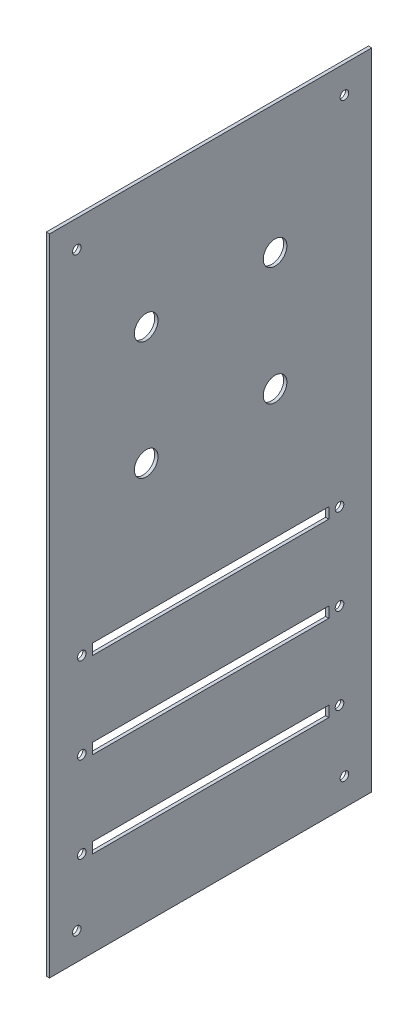
ISO-10303-21;
HEADER;
FILE_DESCRIPTION(('STEP AP214'),'2;1');
FILE_NAME('part.step','',(''),(''),'','','');
FILE_SCHEMA(('AUTOMOTIVE_DESIGN { 1 0 10303 214 1 1 1 1 }'));
ENDSEC;
DATA;
#1=APPLICATION_CONTEXT('core data for automotive mechanical design processes');
#2=APPLICATION_PROTOCOL_DEFINITION('international standard','automotive_design',2000,#1);
#3=PRODUCT_CONTEXT('',#1,'mechanical');
#4=PRODUCT('Part','Part','',(#3));
#5=PRODUCT_RELATED_PRODUCT_CATEGORY('part','',(#4));
#6=PRODUCT_DEFINITION_FORMATION('','',#4);
#7=PRODUCT_DEFINITION_CONTEXT('part definition',#1,'design');
#8=PRODUCT_DEFINITION('design','',#6,#7);
#9=PRODUCT_DEFINITION_SHAPE('','',#8);
#10=(LENGTH_UNIT() NAMED_UNIT(*) SI_UNIT(.MILLI.,.METRE.));
#11=(NAMED_UNIT(*) PLANE_ANGLE_UNIT() SI_UNIT($,.RADIAN.));
#12=(NAMED_UNIT(*) SI_UNIT($,.STERADIAN.) SOLID_ANGLE_UNIT());
#13=UNCERTAINTY_MEASURE_WITH_UNIT(LENGTH_MEASURE(1.E-05),#10,'distance_accuracy_value','');
#14=(GEOMETRIC_REPRESENTATION_CONTEXT(3) GLOBAL_UNCERTAINTY_ASSIGNED_CONTEXT((#13)) GLOBAL_UNIT_ASSIGNED_CONTEXT((#10,
#11,#12)) REPRESENTATION_CONTEXT('',''));
#15=CARTESIAN_POINT('',(0.,0.,0.));
#16=DIRECTION('',(0.,0.,1.));
#17=DIRECTION('',(1.,0.,0.));
#18=AXIS2_PLACEMENT_3D('',#15,#16,#17);
#19=CARTESIAN_POINT('',(1.52,150.,75.));
#20=DIRECTION('',(0.,-1.,0.));
#21=DIRECTION('',(0.,0.,-1.));
#22=AXIS2_PLACEMENT_3D('',#19,#20,#21);
#23=PLANE('',#22);
#24=DIRECTION('',(0.,0.,1.));
#25=VECTOR('',#24,1.);
#26=CARTESIAN_POINT('',(0.,150.,75.));
#27=LINE('',#26,#25);
#28=CARTESIAN_POINT('',(0.,150.,-75.));
#29=VERTEX_POINT('',#28);
#30=CARTESIAN_POINT('',(0.,150.,75.));
#31=VERTEX_POINT('',#30);
#32=EDGE_CURVE('E3880',#29,#31,#27,.T.);
#33=ORIENTED_EDGE('',*,*,#32,.T.);
#34=DIRECTION('',(-1.,0.,0.));
#35=VECTOR('',#34,1.);
#36=CARTESIAN_POINT('',(1.52,150.,75.));
#37=LINE('',#36,#35);
#38=CARTESIAN_POINT('',(1.52,150.,75.));
#39=VERTEX_POINT('',#38);
#40=EDGE_CURVE('E12',#39,#31,#37,.T.);
#41=ORIENTED_EDGE('',*,*,#40,.F.);
#42=DIRECTION('',(0.,0.,1.));
#43=VECTOR('',#42,1.);
#44=CARTESIAN_POINT('',(1.52,150.,75.));
#45=LINE('',#44,#43);
#46=CARTESIAN_POINT('',(1.52,150.,-75.));
#47=VERTEX_POINT('',#46);
#48=EDGE_CURVE('E3878',#47,#39,#45,.T.);
#49=ORIENTED_EDGE('',*,*,#48,.F.);
#50=DIRECTION('',(-1.,0.,0.));
#51=VECTOR('',#50,1.);
#52=CARTESIAN_POINT('',(1.52,150.,-75.));
#53=LINE('',#52,#51);
#54=EDGE_CURVE('E3895',#47,#29,#53,.T.);
#55=ORIENTED_EDGE('',*,*,#54,.T.);
#56=EDGE_LOOP('',(#33,#41,#49,#55));
#57=FACE_BOUND('',#56,.T.);
#58=ADVANCED_FACE('F3572',(#57),#23,.F.);
#59=CARTESIAN_POINT('',(1.52,-150.,75.));
#60=DIRECTION('',(0.,0.,-1.));
#61=DIRECTION('',(0.,1.,0.));
#62=AXIS2_PLACEMENT_3D('',#59,#60,#61);
#63=PLANE('',#62);
#64=DIRECTION('',(0.,-1.,0.));
#65=VECTOR('',#64,1.);
#66=CARTESIAN_POINT('',(0.,-150.,75.));
#67=LINE('',#66,#65);
#68=CARTESIAN_POINT('',(0.,-150.,75.));
#69=VERTEX_POINT('',#68);
#70=EDGE_CURVE('E3899',#31,#69,#67,.T.);
#71=ORIENTED_EDGE('',*,*,#70,.T.);
#72=DIRECTION('',(-1.,0.,0.));
#73=VECTOR('',#72,1.);
#74=CARTESIAN_POINT('',(1.52,-150.,75.));
#75=LINE('',#74,#73);
#76=CARTESIAN_POINT('',(1.52,-150.,75.));
#77=VERTEX_POINT('',#76);
#78=EDGE_CURVE('E3585',#77,#69,#75,.T.);
#79=ORIENTED_EDGE('',*,*,#78,.F.);
#80=DIRECTION('',(0.,-1.,0.));
#81=VECTOR('',#80,1.);
#82=CARTESIAN_POINT('',(1.52,-150.,75.));
#83=LINE('',#82,#81);
#84=EDGE_CURVE('E3885',#39,#77,#83,.T.);
#85=ORIENTED_EDGE('',*,*,#84,.F.);
#86=ORIENTED_EDGE('',*,*,#40,.T.);
#87=EDGE_LOOP('',(#71,#79,#85,#86));
#88=FACE_BOUND('',#87,.T.);
#89=ADVANCED_FACE('F3931',(#88),#63,.F.);
#90=CARTESIAN_POINT('',(1.52,-150.,75.));
#91=DIRECTION('',(0.,1.,0.));
#92=DIRECTION('',(0.,0.,1.));
#93=AXIS2_PLACEMENT_3D('',#90,#91,#92);
#94=PLANE('',#93);
#95=DIRECTION('',(0.,0.,-1.));
#96=VECTOR('',#95,1.);
#97=CARTESIAN_POINT('',(0.,-150.,75.));
#98=LINE('',#97,#96);
#99=CARTESIAN_POINT('',(0.,-150.,-75.));
#100=VERTEX_POINT('',#99);
#101=EDGE_CURVE('E3898',#69,#100,#98,.T.);
#102=ORIENTED_EDGE('',*,*,#101,.T.);
#103=DIRECTION('',(-1.,0.,0.));
#104=VECTOR('',#103,1.);
#105=CARTESIAN_POINT('',(1.52,-150.,-75.));
#106=LINE('',#105,#104);
#107=CARTESIAN_POINT('',(1.52,-150.,-75.));
#108=VERTEX_POINT('',#107);
#109=EDGE_CURVE('E3906',#108,#100,#106,.T.);
#110=ORIENTED_EDGE('',*,*,#109,.F.);
#111=DIRECTION('',(0.,0.,-1.));
#112=VECTOR('',#111,1.);
#113=CARTESIAN_POINT('',(1.52,-150.,75.));
#114=LINE('',#113,#112);
#115=EDGE_CURVE('E3886',#77,#108,#114,.T.);
#116=ORIENTED_EDGE('',*,*,#115,.F.);
#117=ORIENTED_EDGE('',*,*,#78,.T.);
#118=EDGE_LOOP('',(#102,#110,#116,#117));
#119=FACE_BOUND('',#118,.T.);
#120=ADVANCED_FACE('F3920',(#119),#94,.F.);
#121=CARTESIAN_POINT('',(1.52,-150.,-75.));
#122=DIRECTION('',(0.,0.,1.));
#123=DIRECTION('',(1.,0.,0.));
#124=AXIS2_PLACEMENT_3D('',#121,#122,#123);
#125=PLANE('',#124);
#126=DIRECTION('',(0.,1.,0.));
#127=VECTOR('',#126,1.);
#128=CARTESIAN_POINT('',(0.,-150.,-75.));
#129=LINE('',#128,#127);
#130=EDGE_CURVE('E3883',#100,#29,#129,.T.);
#131=ORIENTED_EDGE('',*,*,#130,.T.);
#132=ORIENTED_EDGE('',*,*,#54,.F.);
#133=DIRECTION('',(0.,1.,0.));
#134=VECTOR('',#133,1.);
#135=CARTESIAN_POINT('',(1.52,-150.,-75.));
#136=LINE('',#135,#134);
#137=EDGE_CURVE('E3888',#108,#47,#136,.T.);
#138=ORIENTED_EDGE('',*,*,#137,.F.);
#139=ORIENTED_EDGE('',*,*,#109,.T.);
#140=EDGE_LOOP('',(#131,#132,#138,#139));
#141=FACE_BOUND('',#140,.T.);
#142=ADVANCED_FACE('F3929',(#141),#125,.F.);
#143=CARTESIAN_POINT('',(1.52,0.,0.));
#144=DIRECTION('',(1.,0.,0.));
#145=DIRECTION('',(0.,0.,-1.));
#146=AXIS2_PLACEMENT_3D('',#143,#144,#145);
#147=PLANE('',#146);
#148=CARTESIAN_POINT('',(1.52,35.,-30.));
#149=DIRECTION('',(1.,0.,0.));
#150=DIRECTION('',(0.,0.,-1.));
#151=AXIS2_PLACEMENT_3D('',#148,#149,#150);
#152=CIRCLE('',#151,5.5);
#153=CARTESIAN_POINT('',(1.52,35.,-35.5));
#154=VERTEX_POINT('',#153);
#155=EDGE_CURVE('E4053',#154,#154,#152,.T.);
#156=ORIENTED_EDGE('',*,*,#155,.F.);
#157=EDGE_LOOP('',(#156));
#158=FACE_BOUND('',#157,.T.);
#159=CARTESIAN_POINT('',(1.52,90.,-30.));
#160=DIRECTION('',(1.,0.,0.));
#161=DIRECTION('',(0.,0.,-1.));
#162=AXIS2_PLACEMENT_3D('',#159,#160,#161);
#163=CIRCLE('',#162,5.50000000000001);
#164=CARTESIAN_POINT('',(1.52,90.,-35.5));
#165=VERTEX_POINT('',#164);
#166=EDGE_CURVE('E4063',#165,#165,#163,.T.);
#167=ORIENTED_EDGE('',*,*,#166,.F.);
#168=EDGE_LOOP('',(#167));
#169=FACE_BOUND('',#168,.T.);
#170=CARTESIAN_POINT('',(1.52,35.,30.));
#171=DIRECTION('',(1.,0.,0.));
#172=DIRECTION('',(0.,0.,-1.));
#173=AXIS2_PLACEMENT_3D('',#170,#171,#172);
#174=CIRCLE('',#173,5.5);
#175=CARTESIAN_POINT('',(1.52,35.,24.5));
#176=VERTEX_POINT('',#175);
#177=EDGE_CURVE('E4071',#176,#176,#174,.T.);
#178=ORIENTED_EDGE('',*,*,#177,.F.);
#179=EDGE_LOOP('',(#178));
#180=FACE_BOUND('',#179,.T.);
#181=CARTESIAN_POINT('',(1.52,90.,30.));
#182=DIRECTION('',(1.,0.,0.));
#183=DIRECTION('',(0.,0.,-1.));
#184=AXIS2_PLACEMENT_3D('',#181,#182,#183);
#185=CIRCLE('',#184,5.50000000000001);
#186=CARTESIAN_POINT('',(1.52,90.,24.5));
#187=VERTEX_POINT('',#186);
#188=EDGE_CURVE('E4077',#187,#187,#185,.T.);
#189=ORIENTED_EDGE('',*,*,#188,.F.);
#190=EDGE_LOOP('',(#189));
#191=FACE_BOUND('',#190,.T.);
#192=CARTESIAN_POINT('',(1.52,-27.4999999999999,-60.));
#193=DIRECTION('',(1.,0.,0.));
#194=DIRECTION('',(0.,0.,-1.));
#195=AXIS2_PLACEMENT_3D('',#192,#193,#194);
#196=CIRCLE('',#195,1.99999999999999);
#197=CARTESIAN_POINT('',(1.52,-27.4999999999999,-62.));
#198=VERTEX_POINT('',#197);
#199=EDGE_CURVE('E4090',#198,#198,#196,.T.);
#200=ORIENTED_EDGE('',*,*,#199,.F.);
#201=EDGE_LOOP('',(#200));
#202=FACE_BOUND('',#201,.T.);
#203=CARTESIAN_POINT('',(1.52,-27.4999999999999,60.));
#204=DIRECTION('',(1.,0.,0.));
#205=DIRECTION('',(0.,0.,-1.));
#206=AXIS2_PLACEMENT_3D('',#203,#204,#205);
#207=CIRCLE('',#206,1.99999999999999);
#208=CARTESIAN_POINT('',(1.52,-27.4999999999999,58.));
#209=VERTEX_POINT('',#208);
#210=EDGE_CURVE('E4092',#209,#209,#207,.T.);
#211=ORIENTED_EDGE('',*,*,#210,.F.);
#212=EDGE_LOOP('',(#211));
#213=FACE_BOUND('',#212,.T.);
#214=CARTESIAN_POINT('',(1.52,-67.4999999999999,-60.));
#215=DIRECTION('',(1.,0.,0.));
#216=DIRECTION('',(0.,0.,-1.));
#217=AXIS2_PLACEMENT_3D('',#214,#215,#216);
#218=CIRCLE('',#217,2.);
#219=CARTESIAN_POINT('',(1.52,-67.4999999999999,-62.));
#220=VERTEX_POINT('',#219);
#221=EDGE_CURVE('E4105',#220,#220,#218,.T.);
#222=ORIENTED_EDGE('',*,*,#221,.F.);
#223=EDGE_LOOP('',(#222));
#224=FACE_BOUND('',#223,.T.);
#225=CARTESIAN_POINT('',(1.52,-67.4999999999999,60.));
#226=DIRECTION('',(1.,0.,0.));
#227=DIRECTION('',(0.,0.,-1.));
#228=AXIS2_PLACEMENT_3D('',#225,#226,#227);
#229=CIRCLE('',#228,2.);
#230=CARTESIAN_POINT('',(1.52,-67.4999999999999,58.));
#231=VERTEX_POINT('',#230);
#232=EDGE_CURVE('E4108',#231,#231,#229,.T.);
#233=ORIENTED_EDGE('',*,*,#232,.F.);
#234=EDGE_LOOP('',(#233));
#235=FACE_BOUND('',#234,.T.);
#236=DIRECTION('',(0.,0.,1.));
#237=VECTOR('',#236,1.);
#238=CARTESIAN_POINT('',(1.52,-24.9999999999999,-55.0000000000003));
#239=LINE('',#238,#237);
#240=CARTESIAN_POINT('',(1.52,-24.9999999999999,-55.0000000000003));
#241=VERTEX_POINT('',#240);
#242=CARTESIAN_POINT('',(1.52,-24.9999999999999,54.9999999999997));
#243=VERTEX_POINT('',#242);
#244=EDGE_CURVE('E3588',#241,#243,#239,.T.);
#245=ORIENTED_EDGE('',*,*,#244,.F.);
#246=DIRECTION('',(0.,1.,0.));
#247=VECTOR('',#246,1.);
#248=CARTESIAN_POINT('',(1.52,-29.9999999999999,-55.0000000000003));
#249=LINE('',#248,#247);
#250=CARTESIAN_POINT('',(1.52,-29.9999999999999,-55.0000000000003));
#251=VERTEX_POINT('',#250);
#252=EDGE_CURVE('E3706',#251,#241,#249,.T.);
#253=ORIENTED_EDGE('',*,*,#252,.F.);
#254=DIRECTION('',(0.,0.,-1.));
#255=VECTOR('',#254,1.);
#256=CARTESIAN_POINT('',(1.52,-29.9999999999999,-55.0000000000003));
#257=LINE('',#256,#255);
#258=CARTESIAN_POINT('',(1.52,-29.9999999999999,54.9999999999997));
#259=VERTEX_POINT('',#258);
#260=EDGE_CURVE('E3712',#259,#251,#257,.T.);
#261=ORIENTED_EDGE('',*,*,#260,.F.);
#262=DIRECTION('',(0.,-1.,0.));
#263=VECTOR('',#262,1.);
#264=CARTESIAN_POINT('',(1.52,-29.9999999999999,54.9999999999997));
#265=LINE('',#264,#263);
#266=EDGE_CURVE('E3730',#243,#259,#265,.T.);
#267=ORIENTED_EDGE('',*,*,#266,.F.);
#268=EDGE_LOOP('',(#245,#253,#261,#267));
#269=FACE_BOUND('',#268,.T.);
#270=DIRECTION('',(0.,0.,1.));
#271=VECTOR('',#270,1.);
#272=CARTESIAN_POINT('',(1.52,-64.9999999999999,-55.));
#273=LINE('',#272,#271);
#274=CARTESIAN_POINT('',(1.52,-64.9999999999999,-55.));
#275=VERTEX_POINT('',#274);
#276=CARTESIAN_POINT('',(1.52,-64.9999999999999,55.));
#277=VERTEX_POINT('',#276);
#278=EDGE_CURVE('E3738',#275,#277,#273,.T.);
#279=ORIENTED_EDGE('',*,*,#278,.F.);
#280=DIRECTION('',(0.,1.,0.));
#281=VECTOR('',#280,1.);
#282=CARTESIAN_POINT('',(1.52,-69.9999999999999,-55.));
#283=LINE('',#282,#281);
#284=CARTESIAN_POINT('',(1.52,-69.9999999999999,-55.));
#285=VERTEX_POINT('',#284);
#286=EDGE_CURVE('E3750',#285,#275,#283,.T.);
#287=ORIENTED_EDGE('',*,*,#286,.F.);
#288=DIRECTION('',(0.,0.,-1.));
#289=VECTOR('',#288,1.);
#290=CARTESIAN_POINT('',(1.52,-69.9999999999999,-55.));
#291=LINE('',#290,#289);
#292=CARTESIAN_POINT('',(1.52,-69.9999999999999,55.));
#293=VERTEX_POINT('',#292);
#294=EDGE_CURVE('E3769',#293,#285,#291,.T.);
#295=ORIENTED_EDGE('',*,*,#294,.F.);
#296=DIRECTION('',(0.,-1.,0.));
#297=VECTOR('',#296,1.);
#298=CARTESIAN_POINT('',(1.52,-69.9999999999999,55.));
#299=LINE('',#298,#297);
#300=EDGE_CURVE('E3765',#277,#293,#299,.T.);
#301=ORIENTED_EDGE('',*,*,#300,.F.);
#302=EDGE_LOOP('',(#279,#287,#295,#301));
#303=FACE_BOUND('',#302,.T.);
#304=CARTESIAN_POINT('',(1.52,-107.5,-60.));
#305=DIRECTION('',(1.,0.,0.));
#306=DIRECTION('',(0.,0.,-1.));
#307=AXIS2_PLACEMENT_3D('',#304,#305,#306);
#308=CIRCLE('',#307,1.99999999999999);
#309=CARTESIAN_POINT('',(1.52,-107.5,-62.));
#310=VERTEX_POINT('',#309);
#311=EDGE_CURVE('E3779',#310,#310,#308,.T.);
#312=ORIENTED_EDGE('',*,*,#311,.F.);
#313=EDGE_LOOP('',(#312));
#314=FACE_BOUND('',#313,.T.);
#315=CARTESIAN_POINT('',(1.52,-107.5,60.));
#316=DIRECTION('',(1.,0.,0.));
#317=DIRECTION('',(0.,0.,-1.));
#318=AXIS2_PLACEMENT_3D('',#315,#316,#317);
#319=CIRCLE('',#318,1.99999999999999);
#320=CARTESIAN_POINT('',(1.52,-107.5,58.));
#321=VERTEX_POINT('',#320);
#322=EDGE_CURVE('E3794',#321,#321,#319,.T.);
#323=ORIENTED_EDGE('',*,*,#322,.F.);
#324=EDGE_LOOP('',(#323));
#325=FACE_BOUND('',#324,.T.);
#326=DIRECTION('',(0.,0.,1.));
#327=VECTOR('',#326,1.);
#328=CARTESIAN_POINT('',(1.52,-105.,-55.));
#329=LINE('',#328,#327);
#330=CARTESIAN_POINT('',(1.52,-105.,-55.));
#331=VERTEX_POINT('',#330);
#332=CARTESIAN_POINT('',(1.52,-105.,55.));
#333=VERTEX_POINT('',#332);
#334=EDGE_CURVE('E3803',#331,#333,#329,.T.);
#335=ORIENTED_EDGE('',*,*,#334,.F.);
#336=DIRECTION('',(0.,1.,0.));
#337=VECTOR('',#336,1.);
#338=CARTESIAN_POINT('',(1.52,-110.,-55.));
#339=LINE('',#338,#337);
#340=CARTESIAN_POINT('',(1.52,-110.,-55.));
#341=VERTEX_POINT('',#340);
#342=EDGE_CURVE('E3810',#341,#331,#339,.T.);
#343=ORIENTED_EDGE('',*,*,#342,.F.);
#344=DIRECTION('',(0.,0.,-1.));
#345=VECTOR('',#344,1.);
#346=CARTESIAN_POINT('',(1.52,-110.,-55.));
#347=LINE('',#346,#345);
#348=CARTESIAN_POINT('',(1.52,-110.,55.));
#349=VERTEX_POINT('',#348);
#350=EDGE_CURVE('E3827',#349,#341,#347,.T.);
#351=ORIENTED_EDGE('',*,*,#350,.F.);
#352=DIRECTION('',(0.,-1.,0.));
#353=VECTOR('',#352,1.);
#354=CARTESIAN_POINT('',(1.52,-110.,55.));
#355=LINE('',#354,#353);
#356=EDGE_CURVE('E3825',#333,#349,#355,.T.);
#357=ORIENTED_EDGE('',*,*,#356,.F.);
#358=EDGE_LOOP('',(#335,#343,#351,#357));
#359=FACE_BOUND('',#358,.T.);
#360=CARTESIAN_POINT('',(1.52,137.3,-62.3));
#361=DIRECTION('',(1.,0.,0.));
#362=DIRECTION('',(0.,0.,-1.));
#363=AXIS2_PLACEMENT_3D('',#360,#361,#362);
#364=CIRCLE('',#363,1.99999999999997);
#365=CARTESIAN_POINT('',(1.52,137.3,-64.3));
#366=VERTEX_POINT('',#365);
#367=EDGE_CURVE('E3837',#366,#366,#364,.T.);
#368=ORIENTED_EDGE('',*,*,#367,.F.);
#369=EDGE_LOOP('',(#368));
#370=FACE_BOUND('',#369,.T.);
#371=CARTESIAN_POINT('',(1.52,137.3,62.3));
#372=DIRECTION('',(1.,0.,0.));
#373=DIRECTION('',(0.,0.,-1.));
#374=AXIS2_PLACEMENT_3D('',#371,#372,#373);
#375=CIRCLE('',#374,1.99999999999997);
#376=CARTESIAN_POINT('',(1.52,137.3,60.3));
#377=VERTEX_POINT('',#376);
#378=EDGE_CURVE('E3855',#377,#377,#375,.T.);
#379=ORIENTED_EDGE('',*,*,#378,.F.);
#380=EDGE_LOOP('',(#379));
#381=FACE_BOUND('',#380,.T.);
#382=CARTESIAN_POINT('',(1.52,-137.3,-62.3));
#383=DIRECTION('',(1.,0.,0.));
#384=DIRECTION('',(0.,0.,-1.));
#385=AXIS2_PLACEMENT_3D('',#382,#383,#384);
#386=CIRCLE('',#385,1.99999999999997);
#387=CARTESIAN_POINT('',(1.52,-137.3,-64.3));
#388=VERTEX_POINT('',#387);
#389=EDGE_CURVE('E3864',#388,#388,#386,.T.);
#390=ORIENTED_EDGE('',*,*,#389,.F.);
#391=EDGE_LOOP('',(#390));
#392=FACE_BOUND('',#391,.T.);
#393=CARTESIAN_POINT('',(1.52,-137.3,62.3));
#394=DIRECTION('',(1.,0.,0.));
#395=DIRECTION('',(0.,0.,-1.));
#396=AXIS2_PLACEMENT_3D('',#393,#394,#395);
#397=CIRCLE('',#396,1.99999999999997);
#398=CARTESIAN_POINT('',(1.52,-137.3,60.3));
#399=VERTEX_POINT('',#398);
#400=EDGE_CURVE('E3870',#399,#399,#397,.T.);
#401=ORIENTED_EDGE('',*,*,#400,.F.);
#402=EDGE_LOOP('',(#401));
#403=FACE_BOUND('',#402,.T.);
#404=ORIENTED_EDGE('',*,*,#48,.T.);
#405=ORIENTED_EDGE('',*,*,#84,.T.);
#406=ORIENTED_EDGE('',*,*,#115,.T.);
#407=ORIENTED_EDGE('',*,*,#137,.T.);
#408=EDGE_LOOP('',(#404,#405,#406,#407));
#409=FACE_BOUND('',#408,.T.);
#410=ADVANCED_FACE('F3932',(#158,#169,#180,#191,#202,#213,#224,#235,#269,#303,#314,#325,#359,
#370,#381,#392,#403,#409),#147,.T.);
#411=CARTESIAN_POINT('',(0.,0.,0.));
#412=DIRECTION('',(1.,0.,0.));
#413=DIRECTION('',(0.,0.,-1.));
#414=AXIS2_PLACEMENT_3D('',#411,#412,#413);
#415=PLANE('',#414);
#416=CARTESIAN_POINT('',(0.,35.,-30.));
#417=DIRECTION('',(1.,0.,0.));
#418=DIRECTION('',(0.,0.,-1.));
#419=AXIS2_PLACEMENT_3D('',#416,#417,#418);
#420=CIRCLE('',#419,5.5);
#421=CARTESIAN_POINT('',(0.,35.,-35.5));
#422=VERTEX_POINT('',#421);
#423=EDGE_CURVE('E4055',#422,#422,#420,.T.);
#424=ORIENTED_EDGE('',*,*,#423,.T.);
#425=EDGE_LOOP('',(#424));
#426=FACE_BOUND('',#425,.T.);
#427=CARTESIAN_POINT('',(0.,90.,-30.));
#428=DIRECTION('',(1.,0.,0.));
#429=DIRECTION('',(0.,0.,-1.));
#430=AXIS2_PLACEMENT_3D('',#427,#428,#429);
#431=CIRCLE('',#430,5.50000000000001);
#432=CARTESIAN_POINT('',(0.,90.,-35.5));
#433=VERTEX_POINT('',#432);
#434=EDGE_CURVE('E4070',#433,#433,#431,.T.);
#435=ORIENTED_EDGE('',*,*,#434,.T.);
#436=EDGE_LOOP('',(#435));
#437=FACE_BOUND('',#436,.T.);
#438=CARTESIAN_POINT('',(0.,35.,30.));
#439=DIRECTION('',(1.,0.,0.));
#440=DIRECTION('',(0.,0.,-1.));
#441=AXIS2_PLACEMENT_3D('',#438,#439,#440);
#442=CIRCLE('',#441,5.5);
#443=CARTESIAN_POINT('',(0.,35.,24.5));
#444=VERTEX_POINT('',#443);
#445=EDGE_CURVE('E4074',#444,#444,#442,.T.);
#446=ORIENTED_EDGE('',*,*,#445,.T.);
#447=EDGE_LOOP('',(#446));
#448=FACE_BOUND('',#447,.T.);
#449=CARTESIAN_POINT('',(0.,90.,30.));
#450=DIRECTION('',(1.,0.,0.));
#451=DIRECTION('',(0.,0.,-1.));
#452=AXIS2_PLACEMENT_3D('',#449,#450,#451);
#453=CIRCLE('',#452,5.50000000000001);
#454=CARTESIAN_POINT('',(0.,90.,24.5));
#455=VERTEX_POINT('',#454);
#456=EDGE_CURVE('E4082',#455,#455,#453,.T.);
#457=ORIENTED_EDGE('',*,*,#456,.T.);
#458=EDGE_LOOP('',(#457));
#459=FACE_BOUND('',#458,.T.);
#460=CARTESIAN_POINT('',(0.,-27.4999999999999,-60.));
#461=DIRECTION('',(1.,0.,0.));
#462=DIRECTION('',(0.,0.,-1.));
#463=AXIS2_PLACEMENT_3D('',#460,#461,#462);
#464=CIRCLE('',#463,1.99999999999999);
#465=CARTESIAN_POINT('',(0.,-27.4999999999999,-62.));
#466=VERTEX_POINT('',#465);
#467=EDGE_CURVE('E4094',#466,#466,#464,.T.);
#468=ORIENTED_EDGE('',*,*,#467,.T.);
#469=EDGE_LOOP('',(#468));
#470=FACE_BOUND('',#469,.T.);
#471=CARTESIAN_POINT('',(0.,-27.4999999999999,60.));
#472=DIRECTION('',(1.,0.,0.));
#473=DIRECTION('',(0.,0.,-1.));
#474=AXIS2_PLACEMENT_3D('',#471,#472,#473);
#475=CIRCLE('',#474,1.99999999999999);
#476=CARTESIAN_POINT('',(0.,-27.4999999999999,58.));
#477=VERTEX_POINT('',#476);
#478=EDGE_CURVE('E4096',#477,#477,#475,.T.);
#479=ORIENTED_EDGE('',*,*,#478,.T.);
#480=EDGE_LOOP('',(#479));
#481=FACE_BOUND('',#480,.T.);
#482=CARTESIAN_POINT('',(0.,-67.4999999999999,-60.));
#483=DIRECTION('',(1.,0.,0.));
#484=DIRECTION('',(0.,0.,-1.));
#485=AXIS2_PLACEMENT_3D('',#482,#483,#484);
#486=CIRCLE('',#485,2.);
#487=CARTESIAN_POINT('',(0.,-67.4999999999999,-62.));
#488=VERTEX_POINT('',#487);
#489=EDGE_CURVE('E4110',#488,#488,#486,.T.);
#490=ORIENTED_EDGE('',*,*,#489,.T.);
#491=EDGE_LOOP('',(#490));
#492=FACE_BOUND('',#491,.T.);
#493=CARTESIAN_POINT('',(0.,-67.4999999999999,60.));
#494=DIRECTION('',(1.,0.,0.));
#495=DIRECTION('',(0.,0.,-1.));
#496=AXIS2_PLACEMENT_3D('',#493,#494,#495);
#497=CIRCLE('',#496,2.);
#498=CARTESIAN_POINT('',(0.,-67.4999999999999,58.));
#499=VERTEX_POINT('',#498);
#500=EDGE_CURVE('E3716',#499,#499,#497,.T.);
#501=ORIENTED_EDGE('',*,*,#500,.T.);
#502=EDGE_LOOP('',(#501));
#503=FACE_BOUND('',#502,.T.);
#504=DIRECTION('',(0.,1.,0.));
#505=VECTOR('',#504,1.);
#506=CARTESIAN_POINT('',(0.,-29.9999999999999,-55.0000000000003));
#507=LINE('',#506,#505);
#508=CARTESIAN_POINT('',(0.,-29.9999999999999,-55.0000000000003));
#509=VERTEX_POINT('',#508);
#510=CARTESIAN_POINT('',(0.,-24.9999999999999,-55.0000000000003));
#511=VERTEX_POINT('',#510);
#512=EDGE_CURVE('E3700',#509,#511,#507,.T.);
#513=ORIENTED_EDGE('',*,*,#512,.T.);
#514=DIRECTION('',(0.,0.,1.));
#515=VECTOR('',#514,1.);
#516=CARTESIAN_POINT('',(0.,-24.9999999999999,-55.0000000000003));
#517=LINE('',#516,#515);
#518=CARTESIAN_POINT('',(0.,-24.9999999999999,54.9999999999997));
#519=VERTEX_POINT('',#518);
#520=EDGE_CURVE('E3689',#511,#519,#517,.T.);
#521=ORIENTED_EDGE('',*,*,#520,.T.);
#522=DIRECTION('',(0.,-1.,0.));
#523=VECTOR('',#522,1.);
#524=CARTESIAN_POINT('',(0.,-29.9999999999999,54.9999999999997));
#525=LINE('',#524,#523);
#526=CARTESIAN_POINT('',(0.,-29.9999999999999,54.9999999999997));
#527=VERTEX_POINT('',#526);
#528=EDGE_CURVE('E3698',#519,#527,#525,.T.);
#529=ORIENTED_EDGE('',*,*,#528,.T.);
#530=DIRECTION('',(0.,0.,-1.));
#531=VECTOR('',#530,1.);
#532=CARTESIAN_POINT('',(0.,-29.9999999999999,-55.0000000000003));
#533=LINE('',#532,#531);
#534=EDGE_CURVE('E3599',#527,#509,#533,.T.);
#535=ORIENTED_EDGE('',*,*,#534,.T.);
#536=EDGE_LOOP('',(#513,#521,#529,#535));
#537=FACE_BOUND('',#536,.T.);
#538=DIRECTION('',(0.,1.,0.));
#539=VECTOR('',#538,1.);
#540=CARTESIAN_POINT('',(0.,-69.9999999999999,-55.));
#541=LINE('',#540,#539);
#542=CARTESIAN_POINT('',(0.,-69.9999999999999,-55.));
#543=VERTEX_POINT('',#542);
#544=CARTESIAN_POINT('',(0.,-64.9999999999999,-55.));
#545=VERTEX_POINT('',#544);
#546=EDGE_CURVE('E3754',#543,#545,#541,.T.);
#547=ORIENTED_EDGE('',*,*,#546,.T.);
#548=DIRECTION('',(0.,0.,1.));
#549=VECTOR('',#548,1.);
#550=CARTESIAN_POINT('',(0.,-64.9999999999999,-55.));
#551=LINE('',#550,#549);
#552=CARTESIAN_POINT('',(0.,-64.9999999999999,55.));
#553=VERTEX_POINT('',#552);
#554=EDGE_CURVE('E3745',#545,#553,#551,.T.);
#555=ORIENTED_EDGE('',*,*,#554,.T.);
#556=DIRECTION('',(0.,-1.,0.));
#557=VECTOR('',#556,1.);
#558=CARTESIAN_POINT('',(0.,-69.9999999999999,55.));
#559=LINE('',#558,#557);
#560=CARTESIAN_POINT('',(0.,-69.9999999999999,55.));
#561=VERTEX_POINT('',#560);
#562=EDGE_CURVE('E3746',#553,#561,#559,.T.);
#563=ORIENTED_EDGE('',*,*,#562,.T.);
#564=DIRECTION('',(0.,0.,-1.));
#565=VECTOR('',#564,1.);
#566=CARTESIAN_POINT('',(0.,-69.9999999999999,-55.));
#567=LINE('',#566,#565);
#568=EDGE_CURVE('E3751',#561,#543,#567,.T.);
#569=ORIENTED_EDGE('',*,*,#568,.T.);
#570=EDGE_LOOP('',(#547,#555,#563,#569));
#571=FACE_BOUND('',#570,.T.);
#572=CARTESIAN_POINT('',(0.,-107.5,-60.));
#573=DIRECTION('',(1.,0.,0.));
#574=DIRECTION('',(0.,0.,-1.));
#575=AXIS2_PLACEMENT_3D('',#572,#573,#574);
#576=CIRCLE('',#575,2.);
#577=CARTESIAN_POINT('',(0.,-107.5,-62.));
#578=VERTEX_POINT('',#577);
#579=EDGE_CURVE('E3788',#578,#578,#576,.T.);
#580=ORIENTED_EDGE('',*,*,#579,.T.);
#581=EDGE_LOOP('',(#580));
#582=FACE_BOUND('',#581,.T.);
#583=CARTESIAN_POINT('',(0.,-107.5,60.));
#584=DIRECTION('',(1.,0.,0.));
#585=DIRECTION('',(0.,0.,-1.));
#586=AXIS2_PLACEMENT_3D('',#583,#584,#585);
#587=CIRCLE('',#586,2.);
#588=CARTESIAN_POINT('',(0.,-107.5,58.));
#589=VERTEX_POINT('',#588);
#590=EDGE_CURVE('E3796',#589,#589,#587,.T.);
#591=ORIENTED_EDGE('',*,*,#590,.T.);
#592=EDGE_LOOP('',(#591));
#593=FACE_BOUND('',#592,.T.);
#594=DIRECTION('',(0.,1.,0.));
#595=VECTOR('',#594,1.);
#596=CARTESIAN_POINT('',(0.,-110.,-55.));
#597=LINE('',#596,#595);
#598=CARTESIAN_POINT('',(0.,-110.,-55.));
#599=VERTEX_POINT('',#598);
#600=CARTESIAN_POINT('',(0.,-105.,-55.));
#601=VERTEX_POINT('',#600);
#602=EDGE_CURVE('E3814',#599,#601,#597,.T.);
#603=ORIENTED_EDGE('',*,*,#602,.T.);
#604=DIRECTION('',(0.,0.,1.));
#605=VECTOR('',#604,1.);
#606=CARTESIAN_POINT('',(0.,-105.,-55.));
#607=LINE('',#606,#605);
#608=CARTESIAN_POINT('',(0.,-105.,55.));
#609=VERTEX_POINT('',#608);
#610=EDGE_CURVE('E3802',#601,#609,#607,.T.);
#611=ORIENTED_EDGE('',*,*,#610,.T.);
#612=DIRECTION('',(0.,-1.,0.));
#613=VECTOR('',#612,1.);
#614=CARTESIAN_POINT('',(0.,-110.,55.));
#615=LINE('',#614,#613);
#616=CARTESIAN_POINT('',(0.,-110.,55.));
#617=VERTEX_POINT('',#616);
#618=EDGE_CURVE('E3808',#609,#617,#615,.T.);
#619=ORIENTED_EDGE('',*,*,#618,.T.);
#620=DIRECTION('',(0.,0.,-1.));
#621=VECTOR('',#620,1.);
#622=CARTESIAN_POINT('',(0.,-110.,-55.));
#623=LINE('',#622,#621);
#624=EDGE_CURVE('E3811',#617,#599,#623,.T.);
#625=ORIENTED_EDGE('',*,*,#624,.T.);
#626=EDGE_LOOP('',(#603,#611,#619,#625));
#627=FACE_BOUND('',#626,.T.);
#628=CARTESIAN_POINT('',(0.,137.3,-62.3));
#629=DIRECTION('',(1.,0.,0.));
#630=DIRECTION('',(0.,0.,-1.));
#631=AXIS2_PLACEMENT_3D('',#628,#629,#630);
#632=CIRCLE('',#631,2.);
#633=CARTESIAN_POINT('',(0.,137.3,-64.3));
#634=VERTEX_POINT('',#633);
#635=EDGE_CURVE('E3849',#634,#634,#632,.T.);
#636=ORIENTED_EDGE('',*,*,#635,.T.);
#637=EDGE_LOOP('',(#636));
#638=FACE_BOUND('',#637,.T.);
#639=CARTESIAN_POINT('',(0.,137.3,62.3));
#640=DIRECTION('',(1.,0.,0.));
#641=DIRECTION('',(0.,0.,-1.));
#642=AXIS2_PLACEMENT_3D('',#639,#640,#641);
#643=CIRCLE('',#642,2.);
#644=CARTESIAN_POINT('',(0.,137.3,60.3));
#645=VERTEX_POINT('',#644);
#646=EDGE_CURVE('E3860',#645,#645,#643,.T.);
#647=ORIENTED_EDGE('',*,*,#646,.T.);
#648=EDGE_LOOP('',(#647));
#649=FACE_BOUND('',#648,.T.);
#650=CARTESIAN_POINT('',(0.,-137.3,-62.3));
#651=DIRECTION('',(1.,0.,0.));
#652=DIRECTION('',(0.,0.,-1.));
#653=AXIS2_PLACEMENT_3D('',#650,#651,#652);
#654=CIRCLE('',#653,2.);
#655=CARTESIAN_POINT('',(0.,-137.3,-64.3));
#656=VERTEX_POINT('',#655);
#657=EDGE_CURVE('E3862',#656,#656,#654,.T.);
#658=ORIENTED_EDGE('',*,*,#657,.T.);
#659=EDGE_LOOP('',(#658));
#660=FACE_BOUND('',#659,.T.);
#661=CARTESIAN_POINT('',(0.,-137.3,62.3));
#662=DIRECTION('',(1.,0.,0.));
#663=DIRECTION('',(0.,0.,-1.));
#664=AXIS2_PLACEMENT_3D('',#661,#662,#663);
#665=CIRCLE('',#664,2.);
#666=CARTESIAN_POINT('',(0.,-137.3,60.3));
#667=VERTEX_POINT('',#666);
#668=EDGE_CURVE('E3871',#667,#667,#665,.T.);
#669=ORIENTED_EDGE('',*,*,#668,.T.);
#670=EDGE_LOOP('',(#669));
#671=FACE_BOUND('',#670,.T.);
#672=ORIENTED_EDGE('',*,*,#32,.F.);
#673=ORIENTED_EDGE('',*,*,#130,.F.);
#674=ORIENTED_EDGE('',*,*,#101,.F.);
#675=ORIENTED_EDGE('',*,*,#70,.F.);
#676=EDGE_LOOP('',(#672,#673,#674,#675));
#677=FACE_BOUND('',#676,.T.);
#678=ADVANCED_FACE('F3702',(#426,#437,#448,#459,#470,#481,#492,#503,#537,#571,#582,#593,#627,
#638,#649,#660,#671,#677),#415,.F.);
#679=CARTESIAN_POINT('',(1.52,-137.3,62.3));
#680=DIRECTION('',(1.,0.,0.));
#681=DIRECTION('',(0.,0.,-1.));
#682=AXIS2_PLACEMENT_3D('',#679,#680,#681);
#683=CYLINDRICAL_SURFACE('',#682,1.99999999999999);
#684=ORIENTED_EDGE('',*,*,#668,.F.);
#685=EDGE_LOOP('',(#684));
#686=FACE_BOUND('',#685,.T.);
#687=ORIENTED_EDGE('',*,*,#400,.T.);
#688=EDGE_LOOP('',(#687));
#689=FACE_BOUND('',#688,.T.);
#690=ADVANCED_FACE('F3944',(#686,#689),#683,.F.);
#691=CARTESIAN_POINT('',(1.52,-137.3,-62.3));
#692=DIRECTION('',(1.,0.,0.));
#693=DIRECTION('',(0.,0.,-1.));
#694=AXIS2_PLACEMENT_3D('',#691,#692,#693);
#695=CYLINDRICAL_SURFACE('',#694,1.99999999999999);
#696=ORIENTED_EDGE('',*,*,#657,.F.);
#697=EDGE_LOOP('',(#696));
#698=FACE_BOUND('',#697,.T.);
#699=ORIENTED_EDGE('',*,*,#389,.T.);
#700=EDGE_LOOP('',(#699));
#701=FACE_BOUND('',#700,.T.);
#702=ADVANCED_FACE('F3955',(#698,#701),#695,.F.);
#703=CARTESIAN_POINT('',(1.52,137.3,62.3));
#704=DIRECTION('',(1.,0.,0.));
#705=DIRECTION('',(0.,0.,-1.));
#706=AXIS2_PLACEMENT_3D('',#703,#704,#705);
#707=CYLINDRICAL_SURFACE('',#706,1.99999999999999);
#708=ORIENTED_EDGE('',*,*,#646,.F.);
#709=EDGE_LOOP('',(#708));
#710=FACE_BOUND('',#709,.T.);
#711=ORIENTED_EDGE('',*,*,#378,.T.);
#712=EDGE_LOOP('',(#711));
#713=FACE_BOUND('',#712,.T.);
#714=ADVANCED_FACE('F3957',(#710,#713),#707,.F.);
#715=CARTESIAN_POINT('',(1.52,137.3,-62.3));
#716=DIRECTION('',(1.,0.,0.));
#717=DIRECTION('',(0.,0.,-1.));
#718=AXIS2_PLACEMENT_3D('',#715,#716,#717);
#719=CYLINDRICAL_SURFACE('',#718,1.99999999999999);
#720=ORIENTED_EDGE('',*,*,#635,.F.);
#721=EDGE_LOOP('',(#720));
#722=FACE_BOUND('',#721,.T.);
#723=ORIENTED_EDGE('',*,*,#367,.T.);
#724=EDGE_LOOP('',(#723));
#725=FACE_BOUND('',#724,.T.);
#726=ADVANCED_FACE('F3958',(#722,#725),#719,.F.);
#727=CARTESIAN_POINT('',(0.,-105.,-55.));
#728=DIRECTION('',(0.,1.,0.));
#729=DIRECTION('',(0.,0.,1.));
#730=AXIS2_PLACEMENT_3D('',#727,#728,#729);
#731=PLANE('',#730);
#732=ORIENTED_EDGE('',*,*,#334,.T.);
#733=DIRECTION('',(1.,0.,0.));
#734=VECTOR('',#733,1.);
#735=CARTESIAN_POINT('',(0.,-105.,55.));
#736=LINE('',#735,#734);
#737=EDGE_CURVE('E3817',#609,#333,#736,.T.);
#738=ORIENTED_EDGE('',*,*,#737,.F.);
#739=ORIENTED_EDGE('',*,*,#610,.F.);
#740=DIRECTION('',(1.,0.,0.));
#741=VECTOR('',#740,1.);
#742=CARTESIAN_POINT('',(0.,-105.,-55.));
#743=LINE('',#742,#741);
#744=EDGE_CURVE('E3835',#601,#331,#743,.T.);
#745=ORIENTED_EDGE('',*,*,#744,.T.);
#746=EDGE_LOOP('',(#732,#738,#739,#745));
#747=FACE_BOUND('',#746,.T.);
#748=ADVANCED_FACE('F3963',(#747),#731,.F.);
#749=CARTESIAN_POINT('',(0.,-110.,-55.));
#750=DIRECTION('',(0.,0.,-1.));
#751=DIRECTION('',(-1.,0.,0.));
#752=AXIS2_PLACEMENT_3D('',#749,#750,#751);
#753=PLANE('',#752);
#754=ORIENTED_EDGE('',*,*,#342,.T.);
#755=ORIENTED_EDGE('',*,*,#744,.F.);
#756=ORIENTED_EDGE('',*,*,#602,.F.);
#757=DIRECTION('',(1.,0.,0.));
#758=VECTOR('',#757,1.);
#759=CARTESIAN_POINT('',(0.,-110.,-55.));
#760=LINE('',#759,#758);
#761=EDGE_CURVE('E3840',#599,#341,#760,.T.);
#762=ORIENTED_EDGE('',*,*,#761,.T.);
#763=EDGE_LOOP('',(#754,#755,#756,#762));
#764=FACE_BOUND('',#763,.T.);
#765=ADVANCED_FACE('F3969',(#764),#753,.F.);
#766=CARTESIAN_POINT('',(0.,-110.,-55.));
#767=DIRECTION('',(0.,-1.,0.));
#768=DIRECTION('',(0.,0.,-1.));
#769=AXIS2_PLACEMENT_3D('',#766,#767,#768);
#770=PLANE('',#769);
#771=ORIENTED_EDGE('',*,*,#350,.T.);
#772=ORIENTED_EDGE('',*,*,#761,.F.);
#773=ORIENTED_EDGE('',*,*,#624,.F.);
#774=DIRECTION('',(1.,0.,0.));
#775=VECTOR('',#774,1.);
#776=CARTESIAN_POINT('',(0.,-110.,55.));
#777=LINE('',#776,#775);
#778=EDGE_CURVE('E3838',#617,#349,#777,.T.);
#779=ORIENTED_EDGE('',*,*,#778,.T.);
#780=EDGE_LOOP('',(#771,#772,#773,#779));
#781=FACE_BOUND('',#780,.T.);
#782=ADVANCED_FACE('F3973',(#781),#770,.F.);
#783=CARTESIAN_POINT('',(0.,-110.,55.));
#784=DIRECTION('',(0.,0.,1.));
#785=DIRECTION('',(1.,0.,0.));
#786=AXIS2_PLACEMENT_3D('',#783,#784,#785);
#787=PLANE('',#786);
#788=ORIENTED_EDGE('',*,*,#356,.T.);
#789=ORIENTED_EDGE('',*,*,#778,.F.);
#790=ORIENTED_EDGE('',*,*,#618,.F.);
#791=ORIENTED_EDGE('',*,*,#737,.T.);
#792=EDGE_LOOP('',(#788,#789,#790,#791));
#793=FACE_BOUND('',#792,.T.);
#794=ADVANCED_FACE('F3968',(#793),#787,.F.);
#795=CARTESIAN_POINT('',(1.52,-107.5,60.));
#796=DIRECTION('',(1.,0.,0.));
#797=DIRECTION('',(0.,0.,-1.));
#798=AXIS2_PLACEMENT_3D('',#795,#796,#797);
#799=CYLINDRICAL_SURFACE('',#798,1.99999999999999);
#800=ORIENTED_EDGE('',*,*,#590,.F.);
#801=EDGE_LOOP('',(#800));
#802=FACE_BOUND('',#801,.T.);
#803=ORIENTED_EDGE('',*,*,#322,.T.);
#804=EDGE_LOOP('',(#803));
#805=FACE_BOUND('',#804,.T.);
#806=ADVANCED_FACE('F3975',(#802,#805),#799,.F.);
#807=CARTESIAN_POINT('',(1.52,-107.5,-60.));
#808=DIRECTION('',(1.,0.,0.));
#809=DIRECTION('',(0.,0.,-1.));
#810=AXIS2_PLACEMENT_3D('',#807,#808,#809);
#811=CYLINDRICAL_SURFACE('',#810,1.99999999999999);
#812=ORIENTED_EDGE('',*,*,#579,.F.);
#813=EDGE_LOOP('',(#812));
#814=FACE_BOUND('',#813,.T.);
#815=ORIENTED_EDGE('',*,*,#311,.T.);
#816=EDGE_LOOP('',(#815));
#817=FACE_BOUND('',#816,.T.);
#818=ADVANCED_FACE('F3983',(#814,#817),#811,.F.);
#819=CARTESIAN_POINT('',(0.,-64.9999999999999,-55.));
#820=DIRECTION('',(0.,1.,0.));
#821=DIRECTION('',(0.,0.,1.));
#822=AXIS2_PLACEMENT_3D('',#819,#820,#821);
#823=PLANE('',#822);
#824=ORIENTED_EDGE('',*,*,#278,.T.);
#825=DIRECTION('',(1.,0.,0.));
#826=VECTOR('',#825,1.);
#827=CARTESIAN_POINT('',(0.,-64.9999999999999,55.));
#828=LINE('',#827,#826);
#829=EDGE_CURVE('E3758',#553,#277,#828,.T.);
#830=ORIENTED_EDGE('',*,*,#829,.F.);
#831=ORIENTED_EDGE('',*,*,#554,.F.);
#832=DIRECTION('',(1.,0.,0.));
#833=VECTOR('',#832,1.);
#834=CARTESIAN_POINT('',(0.,-64.9999999999999,-55.));
#835=LINE('',#834,#833);
#836=EDGE_CURVE('E3774',#545,#275,#835,.T.);
#837=ORIENTED_EDGE('',*,*,#836,.T.);
#838=EDGE_LOOP('',(#824,#830,#831,#837));
#839=FACE_BOUND('',#838,.T.);
#840=ADVANCED_FACE('F3989',(#839),#823,.F.);
#841=CARTESIAN_POINT('',(0.,-69.9999999999999,-55.));
#842=DIRECTION('',(0.,0.,-1.));
#843=DIRECTION('',(-1.,0.,0.));
#844=AXIS2_PLACEMENT_3D('',#841,#842,#843);
#845=PLANE('',#844);
#846=ORIENTED_EDGE('',*,*,#286,.T.);
#847=ORIENTED_EDGE('',*,*,#836,.F.);
#848=ORIENTED_EDGE('',*,*,#546,.F.);
#849=DIRECTION('',(1.,0.,0.));
#850=VECTOR('',#849,1.);
#851=CARTESIAN_POINT('',(0.,-69.9999999999999,-55.));
#852=LINE('',#851,#850);
#853=EDGE_CURVE('E3776',#543,#285,#852,.T.);
#854=ORIENTED_EDGE('',*,*,#853,.T.);
#855=EDGE_LOOP('',(#846,#847,#848,#854));
#856=FACE_BOUND('',#855,.T.);
#857=ADVANCED_FACE('F3991',(#856),#845,.F.);
#858=CARTESIAN_POINT('',(0.,-69.9999999999999,-55.));
#859=DIRECTION('',(0.,-1.,0.));
#860=DIRECTION('',(0.,0.,-1.));
#861=AXIS2_PLACEMENT_3D('',#858,#859,#860);
#862=PLANE('',#861);
#863=ORIENTED_EDGE('',*,*,#294,.T.);
#864=ORIENTED_EDGE('',*,*,#853,.F.);
#865=ORIENTED_EDGE('',*,*,#568,.F.);
#866=DIRECTION('',(1.,0.,0.));
#867=VECTOR('',#866,1.);
#868=CARTESIAN_POINT('',(0.,-69.9999999999999,55.));
#869=LINE('',#868,#867);
#870=EDGE_CURVE('E3777',#561,#293,#869,.T.);
#871=ORIENTED_EDGE('',*,*,#870,.T.);
#872=EDGE_LOOP('',(#863,#864,#865,#871));
#873=FACE_BOUND('',#872,.T.);
#874=ADVANCED_FACE('F3997',(#873),#862,.F.);
#875=CARTESIAN_POINT('',(0.,-69.9999999999999,55.));
#876=DIRECTION('',(0.,0.,1.));
#877=DIRECTION('',(1.,0.,0.));
#878=AXIS2_PLACEMENT_3D('',#875,#876,#877);
#879=PLANE('',#878);
#880=ORIENTED_EDGE('',*,*,#300,.T.);
#881=ORIENTED_EDGE('',*,*,#870,.F.);
#882=ORIENTED_EDGE('',*,*,#562,.F.);
#883=ORIENTED_EDGE('',*,*,#829,.T.);
#884=EDGE_LOOP('',(#880,#881,#882,#883));
#885=FACE_BOUND('',#884,.T.);
#886=ADVANCED_FACE('F3993',(#885),#879,.F.);
#887=CARTESIAN_POINT('',(0.,-24.9999999999999,-55.0000000000003));
#888=DIRECTION('',(0.,1.,0.));
#889=DIRECTION('',(0.,0.,1.));
#890=AXIS2_PLACEMENT_3D('',#887,#888,#889);
#891=PLANE('',#890);
#892=ORIENTED_EDGE('',*,*,#244,.T.);
#893=DIRECTION('',(1.,0.,0.));
#894=VECTOR('',#893,1.);
#895=CARTESIAN_POINT('',(0.,-24.9999999999999,54.9999999999997));
#896=LINE('',#895,#894);
#897=EDGE_CURVE('E3686',#519,#243,#896,.T.);
#898=ORIENTED_EDGE('',*,*,#897,.F.);
#899=ORIENTED_EDGE('',*,*,#520,.F.);
#900=DIRECTION('',(1.,0.,0.));
#901=VECTOR('',#900,1.);
#902=CARTESIAN_POINT('',(0.,-24.9999999999999,-55.0000000000003));
#903=LINE('',#902,#901);
#904=EDGE_CURVE('E3735',#511,#241,#903,.T.);
#905=ORIENTED_EDGE('',*,*,#904,.T.);
#906=EDGE_LOOP('',(#892,#898,#899,#905));
#907=FACE_BOUND('',#906,.T.);
#908=ADVANCED_FACE('F3688',(#907),#891,.F.);
#909=CARTESIAN_POINT('',(0.,-29.9999999999999,-55.0000000000003));
#910=DIRECTION('',(0.,0.,-1.));
#911=DIRECTION('',(-1.,0.,0.));
#912=AXIS2_PLACEMENT_3D('',#909,#910,#911);
#913=PLANE('',#912);
#914=ORIENTED_EDGE('',*,*,#252,.T.);
#915=ORIENTED_EDGE('',*,*,#904,.F.);
#916=ORIENTED_EDGE('',*,*,#512,.F.);
#917=DIRECTION('',(1.,0.,0.));
#918=VECTOR('',#917,1.);
#919=CARTESIAN_POINT('',(0.,-29.9999999999999,-55.0000000000003));
#920=LINE('',#919,#918);
#921=EDGE_CURVE('E3737',#509,#251,#920,.T.);
#922=ORIENTED_EDGE('',*,*,#921,.T.);
#923=EDGE_LOOP('',(#914,#915,#916,#922));
#924=FACE_BOUND('',#923,.T.);
#925=ADVANCED_FACE('F4010',(#924),#913,.F.);
#926=CARTESIAN_POINT('',(0.,-29.9999999999999,-55.0000000000003));
#927=DIRECTION('',(0.,-1.,0.));
#928=DIRECTION('',(0.,0.,-1.));
#929=AXIS2_PLACEMENT_3D('',#926,#927,#928);
#930=PLANE('',#929);
#931=ORIENTED_EDGE('',*,*,#260,.T.);
#932=ORIENTED_EDGE('',*,*,#921,.F.);
#933=ORIENTED_EDGE('',*,*,#534,.F.);
#934=DIRECTION('',(1.,0.,0.));
#935=VECTOR('',#934,1.);
#936=CARTESIAN_POINT('',(0.,-29.9999999999999,54.9999999999997));
#937=LINE('',#936,#935);
#938=EDGE_CURVE('E3697',#527,#259,#937,.T.);
#939=ORIENTED_EDGE('',*,*,#938,.T.);
#940=EDGE_LOOP('',(#931,#932,#933,#939));
#941=FACE_BOUND('',#940,.T.);
#942=ADVANCED_FACE('F4011',(#941),#930,.F.);
#943=CARTESIAN_POINT('',(0.,-29.9999999999999,54.9999999999997));
#944=DIRECTION('',(0.,0.,1.));
#945=DIRECTION('',(1.,0.,0.));
#946=AXIS2_PLACEMENT_3D('',#943,#944,#945);
#947=PLANE('',#946);
#948=ORIENTED_EDGE('',*,*,#266,.T.);
#949=ORIENTED_EDGE('',*,*,#938,.F.);
#950=ORIENTED_EDGE('',*,*,#528,.F.);
#951=ORIENTED_EDGE('',*,*,#897,.T.);
#952=EDGE_LOOP('',(#948,#949,#950,#951));
#953=FACE_BOUND('',#952,.T.);
#954=ADVANCED_FACE('F3704',(#953),#947,.F.);
#955=CARTESIAN_POINT('',(1.52,-67.4999999999999,60.));
#956=DIRECTION('',(1.,0.,0.));
#957=DIRECTION('',(0.,0.,-1.));
#958=AXIS2_PLACEMENT_3D('',#955,#956,#957);
#959=CYLINDRICAL_SURFACE('',#958,2.);
#960=ORIENTED_EDGE('',*,*,#500,.F.);
#961=EDGE_LOOP('',(#960));
#962=FACE_BOUND('',#961,.T.);
#963=ORIENTED_EDGE('',*,*,#232,.T.);
#964=EDGE_LOOP('',(#963));
#965=FACE_BOUND('',#964,.T.);
#966=ADVANCED_FACE('F4009',(#962,#965),#959,.F.);
#967=CARTESIAN_POINT('',(1.52,-67.4999999999999,-60.));
#968=DIRECTION('',(1.,0.,0.));
#969=DIRECTION('',(0.,0.,-1.));
#970=AXIS2_PLACEMENT_3D('',#967,#968,#969);
#971=CYLINDRICAL_SURFACE('',#970,2.);
#972=ORIENTED_EDGE('',*,*,#489,.F.);
#973=EDGE_LOOP('',(#972));
#974=FACE_BOUND('',#973,.T.);
#975=ORIENTED_EDGE('',*,*,#221,.T.);
#976=EDGE_LOOP('',(#975));
#977=FACE_BOUND('',#976,.T.);
#978=ADVANCED_FACE('F4018',(#974,#977),#971,.F.);
#979=CARTESIAN_POINT('',(1.52,-27.4999999999999,60.));
#980=DIRECTION('',(1.,0.,0.));
#981=DIRECTION('',(0.,0.,-1.));
#982=AXIS2_PLACEMENT_3D('',#979,#980,#981);
#983=CYLINDRICAL_SURFACE('',#982,1.99999999999999);
#984=ORIENTED_EDGE('',*,*,#478,.F.);
#985=EDGE_LOOP('',(#984));
#986=FACE_BOUND('',#985,.T.);
#987=ORIENTED_EDGE('',*,*,#210,.T.);
#988=EDGE_LOOP('',(#987));
#989=FACE_BOUND('',#988,.T.);
#990=ADVANCED_FACE('F4024',(#986,#989),#983,.F.);
#991=CARTESIAN_POINT('',(1.52,-27.4999999999999,-60.));
#992=DIRECTION('',(1.,0.,0.));
#993=DIRECTION('',(0.,0.,-1.));
#994=AXIS2_PLACEMENT_3D('',#991,#992,#993);
#995=CYLINDRICAL_SURFACE('',#994,1.99999999999999);
#996=ORIENTED_EDGE('',*,*,#467,.F.);
#997=EDGE_LOOP('',(#996));
#998=FACE_BOUND('',#997,.T.);
#999=ORIENTED_EDGE('',*,*,#199,.T.);
#1000=EDGE_LOOP('',(#999));
#1001=FACE_BOUND('',#1000,.T.);
#1002=ADVANCED_FACE('F4026',(#998,#1001),#995,.F.);
#1003=CARTESIAN_POINT('',(1.52,90.,30.));
#1004=DIRECTION('',(1.,0.,0.));
#1005=DIRECTION('',(0.,0.,-1.));
#1006=AXIS2_PLACEMENT_3D('',#1003,#1004,#1005);
#1007=CYLINDRICAL_SURFACE('',#1006,5.50000000000001);
#1008=ORIENTED_EDGE('',*,*,#456,.F.);
#1009=EDGE_LOOP('',(#1008));
#1010=FACE_BOUND('',#1009,.T.);
#1011=ORIENTED_EDGE('',*,*,#188,.T.);
#1012=EDGE_LOOP('',(#1011));
#1013=FACE_BOUND('',#1012,.T.);
#1014=ADVANCED_FACE('F4032',(#1010,#1013),#1007,.F.);
#1015=CARTESIAN_POINT('',(1.52,35.,30.));
#1016=DIRECTION('',(1.,0.,0.));
#1017=DIRECTION('',(0.,0.,-1.));
#1018=AXIS2_PLACEMENT_3D('',#1015,#1016,#1017);
#1019=CYLINDRICAL_SURFACE('',#1018,5.5);
#1020=ORIENTED_EDGE('',*,*,#445,.F.);
#1021=EDGE_LOOP('',(#1020));
#1022=FACE_BOUND('',#1021,.T.);
#1023=ORIENTED_EDGE('',*,*,#177,.T.);
#1024=EDGE_LOOP('',(#1023));
#1025=FACE_BOUND('',#1024,.T.);
#1026=ADVANCED_FACE('F4033',(#1022,#1025),#1019,.F.);
#1027=CARTESIAN_POINT('',(1.52,90.,-30.));
#1028=DIRECTION('',(1.,0.,0.));
#1029=DIRECTION('',(0.,0.,-1.));
#1030=AXIS2_PLACEMENT_3D('',#1027,#1028,#1029);
#1031=CYLINDRICAL_SURFACE('',#1030,5.50000000000001);
#1032=ORIENTED_EDGE('',*,*,#434,.F.);
#1033=EDGE_LOOP('',(#1032));
#1034=FACE_BOUND('',#1033,.T.);
#1035=ORIENTED_EDGE('',*,*,#166,.T.);
#1036=EDGE_LOOP('',(#1035));
#1037=FACE_BOUND('',#1036,.T.);
#1038=ADVANCED_FACE('F4038',(#1034,#1037),#1031,.F.);
#1039=CARTESIAN_POINT('',(1.52,35.,-30.));
#1040=DIRECTION('',(1.,0.,0.));
#1041=DIRECTION('',(0.,0.,-1.));
#1042=AXIS2_PLACEMENT_3D('',#1039,#1040,#1041);
#1043=CYLINDRICAL_SURFACE('',#1042,5.5);
#1044=ORIENTED_EDGE('',*,*,#423,.F.);
#1045=EDGE_LOOP('',(#1044));
#1046=FACE_BOUND('',#1045,.T.);
#1047=ORIENTED_EDGE('',*,*,#155,.T.);
#1048=EDGE_LOOP('',(#1047));
#1049=FACE_BOUND('',#1048,.T.);
#1050=ADVANCED_FACE('F4041',(#1046,#1049),#1043,.F.);
#1051=CLOSED_SHELL('',(#58,#89,#120,#142,#410,#678,#690,#702,#714,#726,#748,#765,#782,#794,#806,
#818,#840,#857,#874,#886,#908,#925,#942,#954,#966,#978,#990,#1002,#1014,#1026,#1038,#1050));
#1052=MANIFOLD_SOLID_BREP('B2',#1051);
#1053=ADVANCED_BREP_SHAPE_REPRESENTATION('',(#18,#1052),#14);
#1054=SHAPE_DEFINITION_REPRESENTATION(#9,#1053);
ENDSEC;
END-ISO-10303-21;
